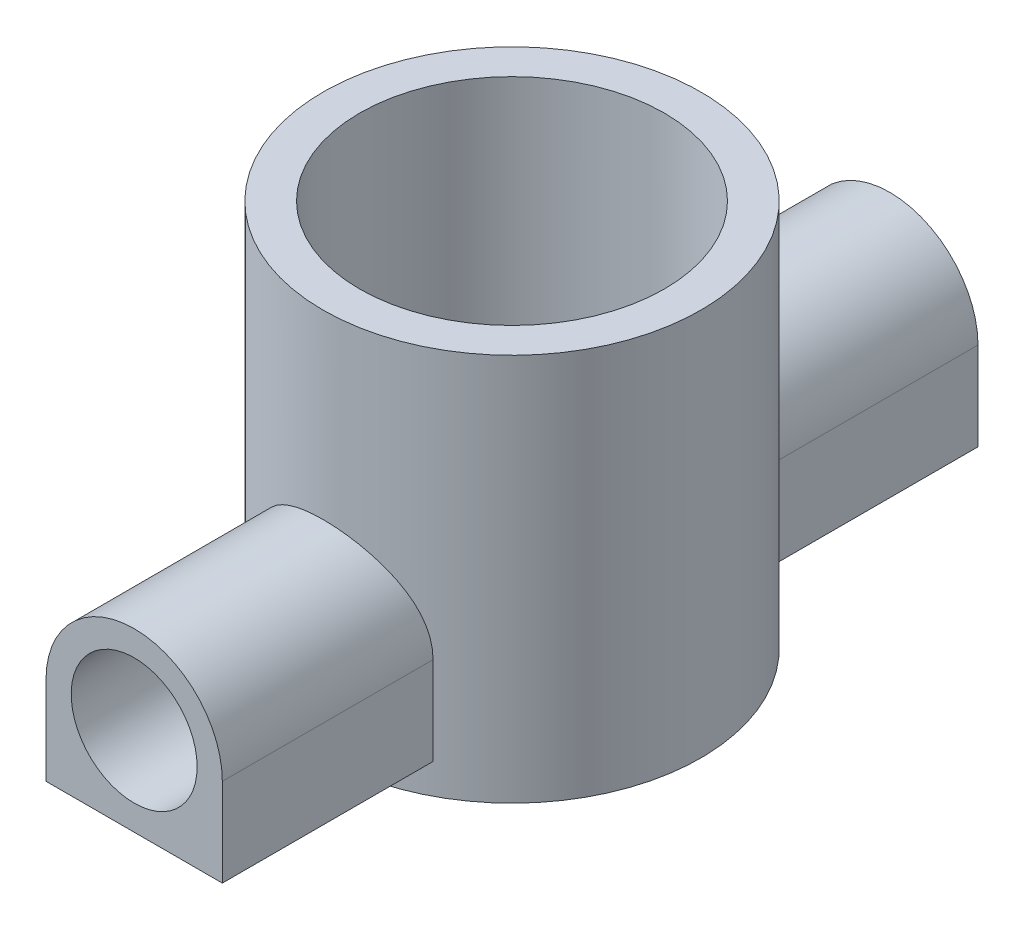
ISO-10303-21;
HEADER;
FILE_DESCRIPTION(('STEP AP214'),'2;1');
FILE_NAME('part.step','',(''),(''),'','','');
FILE_SCHEMA(('AUTOMOTIVE_DESIGN { 1 0 10303 214 1 1 1 1 }'));
ENDSEC;
DATA;
#1=APPLICATION_CONTEXT('core data for automotive mechanical design processes');
#2=APPLICATION_PROTOCOL_DEFINITION('international standard','automotive_design',2000,#1);
#3=PRODUCT_CONTEXT('',#1,'mechanical');
#4=PRODUCT('Part','Part','',(#3));
#5=PRODUCT_RELATED_PRODUCT_CATEGORY('part','',(#4));
#6=PRODUCT_DEFINITION_FORMATION('','',#4);
#7=PRODUCT_DEFINITION_CONTEXT('part definition',#1,'design');
#8=PRODUCT_DEFINITION('design','',#6,#7);
#9=PRODUCT_DEFINITION_SHAPE('','',#8);
#10=(LENGTH_UNIT() NAMED_UNIT(*) SI_UNIT(.MILLI.,.METRE.));
#11=(NAMED_UNIT(*) PLANE_ANGLE_UNIT() SI_UNIT($,.RADIAN.));
#12=(NAMED_UNIT(*) SI_UNIT($,.STERADIAN.) SOLID_ANGLE_UNIT());
#13=UNCERTAINTY_MEASURE_WITH_UNIT(LENGTH_MEASURE(1.E-05),#10,'distance_accuracy_value','');
#14=(GEOMETRIC_REPRESENTATION_CONTEXT(3) GLOBAL_UNCERTAINTY_ASSIGNED_CONTEXT((#13)) GLOBAL_UNIT_ASSIGNED_CONTEXT((#10,
#11,#12)) REPRESENTATION_CONTEXT('',''));
#15=CARTESIAN_POINT('',(0.,0.,0.));
#16=DIRECTION('',(0.,0.,1.));
#17=DIRECTION('',(1.,0.,0.));
#18=AXIS2_PLACEMENT_3D('',#15,#16,#17);
#19=CARTESIAN_POINT('',(0.,15.4,0.));
#20=DIRECTION('',(0.,-1.,0.));
#21=DIRECTION('',(0.,0.,-1.));
#22=AXIS2_PLACEMENT_3D('',#19,#20,#21);
#23=CYLINDRICAL_SURFACE('',#22,7.5);
#24=DIRECTION('',(0.,-1.,0.));
#25=VECTOR('',#24,1.);
#26=CARTESIAN_POINT('',(-3.5,15.4,-6.6332495807108));
#27=LINE('',#26,#25);
#28=CARTESIAN_POINT('',(-3.5,1.2,-6.6332495807108));
#29=VERTEX_POINT('',#28);
#30=CARTESIAN_POINT('',(-3.5,4.7,-6.6332495807108));
#31=VERTEX_POINT('',#30);
#32=EDGE_CURVE('E171',#29,#31,#27,.F.);
#33=ORIENTED_EDGE('',*,*,#32,.F.);
#34=CARTESIAN_POINT('',(0.,1.2,0.));
#35=DIRECTION('',(0.,1.,0.));
#36=DIRECTION('',(0.,0.,1.));
#37=AXIS2_PLACEMENT_3D('',#34,#35,#36);
#38=CIRCLE('',#37,7.5);
#39=CARTESIAN_POINT('',(3.5,1.2,-6.6332495807108));
#40=VERTEX_POINT('',#39);
#41=EDGE_CURVE('E164',#40,#29,#38,.T.);
#42=ORIENTED_EDGE('',*,*,#41,.F.);
#43=DIRECTION('',(0.,-1.,0.));
#44=VECTOR('',#43,1.);
#45=CARTESIAN_POINT('',(3.5,15.4,-6.6332495807108));
#46=LINE('',#45,#44);
#47=CARTESIAN_POINT('',(3.5,4.7,-6.6332495807108));
#48=VERTEX_POINT('',#47);
#49=EDGE_CURVE('E157',#40,#48,#46,.F.);
#50=ORIENTED_EDGE('',*,*,#49,.T.);
#51=CARTESIAN_POINT('',(0.,8.2,-7.5));
#52=CARTESIAN_POINT('',(0.0927638453646091,8.19999932260451,-7.49999942767583));
#53=CARTESIAN_POINT('',(0.185544973897901,8.19630725122517,-7.49827449171282));
#54=CARTESIAN_POINT('',(0.3704319500913,8.18157850785036,-7.4914182892734));
#55=CARTESIAN_POINT('',(0.462537422211857,8.1705380242676,-7.48628525503565));
#56=CARTESIAN_POINT('',(0.645509436311291,8.14120793246424,-7.47273316806579));
#57=CARTESIAN_POINT('',(0.736373591039177,8.1229059635181,-7.4643085126086));
#58=CARTESIAN_POINT('',(0.916063291209002,8.07925930665342,-7.4443954004826));
#59=CARTESIAN_POINT('',(1.00488798706432,8.05391173934351,-7.43290569126674));
#60=CARTESIAN_POINT('',(1.26666253016023,7.96789466452443,-7.39435378103281));
#61=CARTESIAN_POINT('',(1.43580119869903,7.89710574515754,-7.36313885007306));
#62=CARTESIAN_POINT('',(1.75950338829757,7.73105839599086,-7.29257773304033));
#63=CARTESIAN_POINT('',(1.9140693470767,7.63580406872244,-7.25323291046068));
#64=CARTESIAN_POINT('',(2.21388312396607,7.41752261873278,-7.1675879778359));
#65=CARTESIAN_POINT('',(2.35815845647141,7.29326112984414,-7.1210251056879));
#66=CARTESIAN_POINT('',(2.62467884488556,7.0231738101825,-7.02716673961223));
#67=CARTESIAN_POINT('',(2.74690939686651,6.87733389632691,-6.97987078542521));
#68=CARTESIAN_POINT('',(2.9738862328449,6.55660199043476,-6.88636735821798));
#69=CARTESIAN_POINT('',(3.07697229331171,6.38043558144155,-6.84043205060674));
#70=CARTESIAN_POINT('',(3.20791049641241,6.10348872920391,-6.77950058380062));
#71=CARTESIAN_POINT('',(3.24761799735631,6.00902100557189,-6.76051333791107));
#72=CARTESIAN_POINT('',(3.31874549019509,5.8164419545529,-6.72588242044448));
#73=CARTESIAN_POINT('',(3.35017010258259,5.71833269354297,-6.71023688566883));
#74=CARTESIAN_POINT('',(3.40284235726279,5.52472314293985,-6.68367312506865));
#75=CARTESIAN_POINT('',(3.42455692511124,5.42937889755627,-6.67254121789948));
#76=CARTESIAN_POINT('',(3.45996135373743,5.23687860867574,-6.65425164734672));
#77=CARTESIAN_POINT('',(3.47365522302899,5.13972349529254,-6.64709199883736));
#78=CARTESIAN_POINT('',(3.49283211593813,4.94442134510731,-6.63703590449111));
#79=CARTESIAN_POINT('',(3.4983187287039,4.84627476080538,-6.63413759512046));
#80=CARTESIAN_POINT('',(3.5010210042241,4.6498673249749,-6.63270993207384));
#81=CARTESIAN_POINT('',(3.49823728949815,4.55160648260323,-6.63418024956497));
#82=CARTESIAN_POINT('',(3.47889646600487,4.27773983042413,-6.64436341913261));
#83=CARTESIAN_POINT('',(3.45313558768331,4.102860565271,-6.65791178683922));
#84=CARTESIAN_POINT('',(3.37609411166591,3.76038253932222,-6.69729774655889));
#85=CARTESIAN_POINT('',(3.32480695547659,3.59278566163697,-6.72313849679124));
#86=CARTESIAN_POINT('',(3.19717816386537,3.26482846215623,-6.78477442823383));
#87=CARTESIAN_POINT('',(3.12028603410109,3.10472414431264,-6.82078542158217));
#88=CARTESIAN_POINT('',(2.94403037674033,2.79898260375468,-6.89869220896006));
#89=CARTESIAN_POINT('',(2.84465702922664,2.65335174325504,-6.94059057158502));
#90=CARTESIAN_POINT('',(2.61364416716534,2.36403389168892,-7.03106306694425));
#91=CARTESIAN_POINT('',(2.47967281957972,2.22227472917152,-7.07986810135457));
#92=CARTESIAN_POINT('',(2.18952336499836,1.96249689632761,-7.17490678271816));
#93=CARTESIAN_POINT('',(2.0333371656424,1.84448691528006,-7.22113948405388));
#94=CARTESIAN_POINT('',(1.69605016148321,1.63168691162194,-7.30785580019119));
#95=CARTESIAN_POINT('',(1.51426010828906,1.53787361396942,-7.34807600155865));
#96=CARTESIAN_POINT('',(1.13511968908022,1.38286818859894,-7.41609640475845));
#97=CARTESIAN_POINT('',(0.937780247501101,1.3216533888504,-7.44390523642785));
#98=CARTESIAN_POINT('',(0.549075448624818,1.23806153989473,-7.48222921873809));
#99=CARTESIAN_POINT('',(0.358377168623558,1.21310960658165,-7.4938877965312));
#100=CARTESIAN_POINT('',(-0.0248289899829373,1.19484164923643,-7.50240326670637));
#101=CARTESIAN_POINT('',(-0.217336137303141,1.20151334692313,-7.49926590380494));
#102=CARTESIAN_POINT('',(-0.585346655775639,1.24464943087465,-7.47924692484529));
#103=CARTESIAN_POINT('',(-0.761138118207001,1.27913469824773,-7.46327859026208));
#104=CARTESIAN_POINT('',(-1.10415343737415,1.37396324111249,-7.42029246708885));
#105=CARTESIAN_POINT('',(-1.2713762886416,1.43430954347702,-7.39327338509468));
#106=CARTESIAN_POINT('',(-1.59836577643509,1.58097349973798,-7.32965455475482));
#107=CARTESIAN_POINT('',(-1.7577468744526,1.66803037496716,-7.29278658042767));
#108=CARTESIAN_POINT('',(-2.06020334105628,1.86483606762935,-7.21318654056169));
#109=CARTESIAN_POINT('',(-2.20327150158043,1.97459485635478,-7.17045190100833));
#110=CARTESIAN_POINT('',(-2.4823180096738,2.22487644520006,-7.0789482010265));
#111=CARTESIAN_POINT('',(-2.61657054991578,2.36725436671502,-7.02997877267032));
#112=CARTESIAN_POINT('',(-2.85993721540419,2.67294486789053,-6.93454280124186));
#113=CARTESIAN_POINT('',(-2.96903933820144,2.83626738524768,-6.88807746125837));
#114=CARTESIAN_POINT('',(-3.16218147379911,3.18613434681733,-6.80163199385778));
#115=CARTESIAN_POINT('',(-3.24529405280429,3.37326008207658,-6.76191102793616));
#116=CARTESIAN_POINT('',(-3.37798692200635,3.76131515608505,-6.69662339878012));
#117=CARTESIAN_POINT('',(-3.427604313045,3.96222894977932,-6.67104108063186));
#118=CARTESIAN_POINT('',(-3.48780904215959,4.3526888681153,-6.63974657685124));
#119=CARTESIAN_POINT('',(-3.50151146735279,4.54162714764103,-6.63245112375186));
#120=CARTESIAN_POINT('',(-3.49822481559427,4.91913456236046,-6.63418718298948));
#121=CARTESIAN_POINT('',(-3.48124435914999,5.10770378634161,-6.64321410947364));
#122=CARTESIAN_POINT('',(-3.41988100883993,5.46475014177479,-6.674987185247));
#123=CARTESIAN_POINT('',(-3.37758601959937,5.63368984620401,-6.69668521740729));
#124=CARTESIAN_POINT('',(-3.26913984460832,5.96199576355792,-6.75028601323557));
#125=CARTESIAN_POINT('',(-3.20298155265185,6.12135910824862,-6.7821918163354));
#126=CARTESIAN_POINT('',(-3.04371067133753,6.43759115600262,-6.85521498886291));
#127=CARTESIAN_POINT('',(-2.94910293756554,6.59359539934138,-6.89680253184365));
#128=CARTESIAN_POINT('',(-2.73743366831169,6.88847533118703,-6.9835181206314));
#129=CARTESIAN_POINT('',(-2.62036164941979,7.02734297264253,-7.02864781362001));
#130=CARTESIAN_POINT('',(-2.35327737967147,7.29843077725675,-7.12278662309544));
#131=CARTESIAN_POINT('',(-2.20113848145156,7.42858536167878,-7.17173056467306));
#132=CARTESIAN_POINT('',(-1.87546575175447,7.66187137331207,-7.26368760962734));
#133=CARTESIAN_POINT('',(-1.70192179975452,7.76498994505046,-7.30669788699116));
#134=CARTESIAN_POINT('',(-1.42948200173221,7.89636114009806,-7.36309694154533));
#135=CARTESIAN_POINT('',(-1.33685004556919,7.93620917842171,-7.38051647750378));
#136=CARTESIAN_POINT('',(-1.14803708873528,8.00789778489746,-7.41222958111216));
#137=CARTESIAN_POINT('',(-1.05185784004172,8.039742246791,-7.42652466836398));
#138=CARTESIAN_POINT('',(-0.856902795337602,8.09499107130347,-7.45153410473169));
#139=CARTESIAN_POINT('',(-0.758133588460742,8.11841497284418,-7.46225673901333));
#140=CARTESIAN_POINT('',(-0.55864641216854,8.15661887752538,-7.47983449505061));
#141=CARTESIAN_POINT('',(-0.457929779112262,8.1714046050576,-7.48669217794642));
#142=CARTESIAN_POINT('',(-0.297487480193374,8.187842785519,-7.49433264911904));
#143=CARTESIAN_POINT('',(-0.238106005252081,8.19239926706965,-7.49645553942725));
#144=CARTESIAN_POINT('',(-0.119152065908935,8.19847812211285,-7.49928941274602));
#145=CARTESIAN_POINT('',(-0.0595795977204067,8.20000043507199,-7.50000036758765));
#146=CARTESIAN_POINT('',(0.,8.2,-7.5));
#147=B_SPLINE_CURVE_WITH_KNOTS('',3,(#51,#52,#53,#54,#55,#56,#57,#58,#59,#60,#61,#62,#63,#64,
#65,#66,#67,#68,#69,#70,#71,#72,#73,#74,#75,#76,#77,#78,#79,#80,#81,#82,#83,#84,#85,#86,#87,#88,
#89,#90,#91,#92,#93,#94,#95,#96,#97,#98,#99,#100,#101,#102,#103,#104,#105,#106,#107,#108,#109,
#110,#111,#112,#113,#114,#115,#116,#117,#118,#119,#120,#121,#122,#123,#124,#125,#126,#127,#128,
#129,#130,#131,#132,#133,#134,#135,#136,#137,#138,#139,#140,#141,#142,#143,#144,#145,#146),
.UNSPECIFIED.,.T.,.F.,(4,2,2,2,2,2,2,2,2,2,2,2,2,2,2,2,2,2,2,2,2,2,2,2,2,2,2,2,2,2,2,2,2,2,2,2,
2,2,2,2,2,2,2,2,2,2,2,4),(0.,0.278231948691083,0.556608327586484,0.835460614510282,
1.11442703061858,1.66968567671646,2.22485127386643,2.81039094929482,3.39631447468597,
4.02045147283506,4.33274243906661,4.64485882771903,4.93970407469387,5.23440184050609,
5.52897069314465,5.82351737371777,6.35264790107148,6.88191444872486,7.42338613242744,
7.96509479212314,8.56561945447959,9.16636343712319,9.788504036431,10.4102113742534,
10.985156722838,11.5598788597914,12.0969740408906,12.6341321028075,13.1877514083731,
13.7416143968142,14.3441139862917,14.9469005121136,15.5692340232258,16.1908770725114,
16.7564837638741,17.321931569945,17.8461577421246,18.3705401516402,18.9296569883146,
19.4890353854765,20.1045488653448,20.7203544898078,21.0270042419757,21.3335045189413,
21.6392889361398,21.9448704839423,22.1235674407271,22.3022679625826),.UNSPECIFIED.);
#148=EDGE_CURVE('E166',#31,#48,#147,.T.);
#149=ORIENTED_EDGE('',*,*,#148,.F.);
#150=EDGE_LOOP('',(#33,#42,#50,#149));
#151=FACE_BOUND('',#150,.T.);
#152=CARTESIAN_POINT('',(0.,15.4,0.));
#153=DIRECTION('',(0.,1.,0.));
#154=DIRECTION('',(0.,0.,1.));
#155=AXIS2_PLACEMENT_3D('',#152,#153,#154);
#156=CIRCLE('',#155,7.5);
#157=CARTESIAN_POINT('',(0.,15.4,7.5));
#158=VERTEX_POINT('',#157);
#159=EDGE_CURVE('E154',#158,#158,#156,.T.);
#160=ORIENTED_EDGE('',*,*,#159,.F.);
#161=EDGE_LOOP('',(#160));
#162=FACE_BOUND('',#161,.T.);
#163=CARTESIAN_POINT('',(0.,0.,0.));
#164=DIRECTION('',(0.,1.,0.));
#165=DIRECTION('',(0.,0.,1.));
#166=AXIS2_PLACEMENT_3D('',#163,#164,#165);
#167=CIRCLE('',#166,7.5);
#168=CARTESIAN_POINT('',(0.,0.,7.5));
#169=VERTEX_POINT('',#168);
#170=EDGE_CURVE('E158',#169,#169,#167,.T.);
#171=ORIENTED_EDGE('',*,*,#170,.T.);
#172=EDGE_LOOP('',(#171));
#173=FACE_BOUND('',#172,.T.);
#174=DIRECTION('',(0.,-1.,0.));
#175=VECTOR('',#174,1.);
#176=CARTESIAN_POINT('',(-3.5,15.4,6.6332495807108));
#177=LINE('',#176,#175);
#178=CARTESIAN_POINT('',(-3.5,4.7,6.6332495807108));
#179=VERTEX_POINT('',#178);
#180=CARTESIAN_POINT('',(-3.5,1.2,6.6332495807108));
#181=VERTEX_POINT('',#180);
#182=EDGE_CURVE('E12',#179,#181,#177,.T.);
#183=ORIENTED_EDGE('',*,*,#182,.F.);
#184=CARTESIAN_POINT('',(-3.5,4.7,6.6332495807108));
#185=CARTESIAN_POINT('',(-3.49999926131128,4.60785613938988,6.63325043965867));
#186=CARTESIAN_POINT('',(-3.49635593724679,4.51569336032134,6.63517633755873));
#187=CARTESIAN_POINT('',(-3.48182616818394,4.33206166603421,6.64281200802185));
#188=CARTESIAN_POINT('',(-3.47093577020917,4.24059315706568,6.6485238456503));
#189=CARTESIAN_POINT('',(-3.44201715681388,4.05891520694296,6.66354142730972));
#190=CARTESIAN_POINT('',(-3.42397598741124,3.96870836009927,6.67285369294168));
#191=CARTESIAN_POINT('',(-3.38097200645888,3.79035202706629,6.6947445505249));
#192=CARTESIAN_POINT('',(-3.35600623171901,3.70220343919812,6.70732454066034));
#193=CARTESIAN_POINT('',(-3.271387476881,3.44263634342261,6.74922269793659));
#194=CARTESIAN_POINT('',(-3.20183735269974,3.27501535949099,6.78279629307568));
#195=CARTESIAN_POINT('',(-3.03871915346707,2.95395097886513,6.85741831296518));
#196=CARTESIAN_POINT('',(-2.94515259204987,2.80050668951429,6.89846626659733));
#197=CARTESIAN_POINT('',(-2.72878224921516,2.49990522846133,6.98701266587335));
#198=CARTESIAN_POINT('',(-2.60436854334458,2.35397811886385,7.03476239297403));
#199=CARTESIAN_POINT('',(-2.33320405382943,2.0841294125564,7.12928988190124));
#200=CARTESIAN_POINT('',(-2.18644333500182,1.96021765693643,7.17606720084288));
#201=CARTESIAN_POINT('',(-1.86452679822815,1.73103846377823,7.26656834223257));
#202=CARTESIAN_POINT('',(-1.6882307420245,1.6272322571775,7.30996718088236));
#203=CARTESIAN_POINT('',(-1.31827760423816,1.4513037009945,7.3856412674133));
#204=CARTESIAN_POINT('',(-1.12463017132352,1.37916387257901,7.41792264965132));
#205=CARTESIAN_POINT('',(-0.738475207353315,1.27331732443001,7.46592765984064));
#206=CARTESIAN_POINT('',(-0.546672377252428,1.23746567659284,7.48257054310927));
#207=CARTESIAN_POINT('',(-0.159103476100376,1.19820517449856,7.5008162742564));
#208=CARTESIAN_POINT('',(0.036660489268547,1.19477951469839,7.50242691294878));
#209=CARTESIAN_POINT('',(0.410695330611613,1.21951469763489,7.4909075993106));
#210=CARTESIAN_POINT('',(0.58916503565865,1.24529497306625,7.47888852606437));
#211=CARTESIAN_POINT('',(0.938902152687619,1.32352572395687,7.4430755092787));
#212=CARTESIAN_POINT('',(1.11016902876457,1.37597818009267,7.4192806912758));
#213=CARTESIAN_POINT('',(1.44378221998318,1.50655754490628,7.36169830806362));
#214=CARTESIAN_POINT('',(1.60595739011388,1.58505571152273,7.32776699747503));
#215=CARTESIAN_POINT('',(1.91525132180226,1.76506088200437,7.25307965956888));
#216=CARTESIAN_POINT('',(2.06236453370182,1.8665763227356,7.21232113120368));
#217=CARTESIAN_POINT('',(2.35069007475366,2.09971632071152,7.12382550391317));
#218=CARTESIAN_POINT('',(2.49033646243841,2.23316731605842,7.07578970458541));
#219=CARTESIAN_POINT('',(2.74603848228227,2.52136419179472,6.98053903056489));
#220=CARTESIAN_POINT('',(2.86207997004237,2.67612274740592,6.93332466348922));
#221=CARTESIAN_POINT('',(3.07289421264302,3.01225185768652,6.84260060059413));
#222=CARTESIAN_POINT('',(3.16632273686182,3.19456294651887,6.79939178934865));
#223=CARTESIAN_POINT('',(3.28192113830258,3.47953018448027,6.74394606599791));
#224=CARTESIAN_POINT('',(3.31636861599758,3.57646108769959,6.72702242161305));
#225=CARTESIAN_POINT('',(3.37671201980083,3.77349705237814,6.69693644311859));
#226=CARTESIAN_POINT('',(3.40261288757297,3.87360024278493,6.68377193606454));
#227=CARTESIAN_POINT('',(3.44391578144786,4.06862628480971,6.66257769524817));
#228=CARTESIAN_POINT('',(3.45995493643312,4.16338134341116,6.65423909825648));
#229=CARTESIAN_POINT('',(3.48419262800498,4.35411392168352,6.64158034275249));
#230=CARTESIAN_POINT('',(3.49239499947884,4.45009082012979,6.63725821882937));
#231=CARTESIAN_POINT('',(3.50085062954339,4.64247532564968,6.63280265407604));
#232=CARTESIAN_POINT('',(3.50110572563237,4.73888282800709,6.63266824499968));
#233=CARTESIAN_POINT('',(3.49367901057855,4.93127729604442,6.63658141347895));
#234=CARTESIAN_POINT('',(3.48599758814267,5.02726428208875,6.64062878622342));
#235=CARTESIAN_POINT('',(3.45324638584259,5.29633533441687,6.65775748040969));
#236=CARTESIAN_POINT('',(3.4190840761011,5.46811302057922,6.67552471879317));
#237=CARTESIAN_POINT('',(3.32616520624864,5.80314649255415,6.72229645159043));
#238=CARTESIAN_POINT('',(3.26740179307056,5.96639988951355,6.75130407704271));
#239=CARTESIAN_POINT('',(3.12403403965031,6.28835223510954,6.8188675797935));
#240=CARTESIAN_POINT('',(3.03836581226062,6.44649666789497,6.85780114432773));
#241=CARTESIAN_POINT('',(2.84459425000124,6.7470216127766,6.94041543951003));
#242=CARTESIAN_POINT('',(2.73647983367251,6.8893942850686,6.98409850984871));
#243=CARTESIAN_POINT('',(2.48734285087687,7.17022319151001,7.07690614557722));
#244=CARTESIAN_POINT('',(2.34403888577291,7.30663725802437,7.12611360813319));
#245=CARTESIAN_POINT('',(2.03561304104541,7.55400821664125,7.22026743382273));
#246=CARTESIAN_POINT('',(1.87048659408059,7.66495976622107,7.26521290154959));
#247=CARTESIAN_POINT('',(1.51947024529831,7.85943409867268,7.34670682708664));
#248=CARTESIAN_POINT('',(1.33331127569034,7.94253061493065,7.38312242529594));
#249=CARTESIAN_POINT('',(0.947480328770498,8.07547435431301,7.44246322384021));
#250=CARTESIAN_POINT('',(0.747818780316316,8.12534692241486,7.46539870594139));
#251=CARTESIAN_POINT('',(0.358651339101251,8.1866726516826,7.49374585119208));
#252=CARTESIAN_POINT('',(0.169689224472713,8.20098570068088,7.5004606553489));
#253=CARTESIAN_POINT('',(-0.208004011053015,8.19890944076257,7.49949041112254));
#254=CARTESIAN_POINT('',(-0.396735180040015,8.18252830135038,7.49180919435564));
#255=CARTESIAN_POINT('',(-0.758277575824747,8.12153128417566,7.46365916594198));
#256=CARTESIAN_POINT('',(-0.931404852084313,8.07843945832568,7.44388132123884));
#257=CARTESIAN_POINT('',(-1.26778311811106,7.96712840884814,7.39402864886138));
#258=CARTESIAN_POINT('',(-1.43103249754564,7.89890510097077,7.36395214755402));
#259=CARTESIAN_POINT('',(-1.75125880642597,7.73592342663712,7.29459745102416));
#260=CARTESIAN_POINT('',(-1.9076154395029,7.64010190987166,7.25496378476882));
#261=CARTESIAN_POINT('',(-2.20271728406843,7.42604006882807,7.17088679464799));
#262=CARTESIAN_POINT('',(-2.34145452865148,7.30778966277994,7.1264413117453));
#263=CARTESIAN_POINT('',(-2.6100692474085,7.04020660725797,7.03274489555197));
#264=CARTESIAN_POINT('',(-2.73811546970186,6.88906156070508,6.98341321740506));
#265=CARTESIAN_POINT('',(-2.96757613147988,6.56619222573724,6.88904451074315));
#266=CARTESIAN_POINT('',(-3.06897170586697,6.39445348429391,6.84401053871511));
#267=CARTESIAN_POINT('',(-3.19913423254043,6.12331143846475,6.78364714955043));
#268=CARTESIAN_POINT('',(-3.23907342645553,6.02995069293831,6.76461324461053));
#269=CARTESIAN_POINT('',(-3.31083809378394,5.83959564069816,6.72978037193507));
#270=CARTESIAN_POINT('',(-3.34266769160988,5.74260320990733,6.71397976060548));
#271=CARTESIAN_POINT('',(-3.39775826940733,5.54595653504874,6.68626866476573));
#272=CARTESIAN_POINT('',(-3.42104161787016,5.44630998252332,6.67434803441087));
#273=CARTESIAN_POINT('',(-3.45882212262022,5.24499746726423,6.6548482997478));
#274=CARTESIAN_POINT('',(-3.4733257000903,5.14333303666771,6.64726602275977));
#275=CARTESIAN_POINT('',(-3.4888820741993,4.98450720602331,6.63910656509959));
#276=CARTESIAN_POINT('',(-3.49304884992003,4.92771337273911,6.63691338325277));
#277=CARTESIAN_POINT('',(-3.49860810504594,4.81394877625615,6.63398459194967));
#278=CARTESIAN_POINT('',(-3.50000045677498,4.75697800503572,6.63324904957247));
#279=CARTESIAN_POINT('',(-3.5,4.7,6.6332495807108));
#280=B_SPLINE_CURVE_WITH_KNOTS('',3,(#184,#185,#186,#187,#188,#189,#190,#191,#192,#193,#194,
#195,#196,#197,#198,#199,#200,#201,#202,#203,#204,#205,#206,#207,#208,#209,#210,#211,#212,#213,
#214,#215,#216,#217,#218,#219,#220,#221,#222,#223,#224,#225,#226,#227,#228,#229,#230,#231,#232,
#233,#234,#235,#236,#237,#238,#239,#240,#241,#242,#243,#244,#245,#246,#247,#248,#249,#250,#251,
#252,#253,#254,#255,#256,#257,#258,#259,#260,#261,#262,#263,#264,#265,#266,#267,#268,#269,#270,
#271,#272,#273,#274,#275,#276,#277,#278,#279),.UNSPECIFIED.,.T.,.F.,(4,2,2,2,2,2,2,2,2,2,2,2,2,
2,2,2,2,2,2,2,2,2,2,2,2,2,2,2,2,2,2,2,2,2,2,2,2,2,2,2,2,2,2,2,2,2,2,4),(0.,0.276372470319851,
0.552895813990725,0.82992240006127,1.10706771525189,1.6581011458798,2.20909985618996,
2.79941855321357,3.39000046847941,4.01417190802138,4.63799839023429,5.22231177145619,
5.80632230171524,6.34595217268062,6.8856221224215,7.4333410683062,7.98126110330555,
8.57578045456666,9.17065500781635,9.79510464889735,10.1074819520462,10.4196783203378,
10.7086761309505,10.99753244952,11.2863219808071,11.575097368718,12.1006122475418,
12.6262736152265,13.1761037763696,13.7262060314043,14.3350584888907,14.9440385786994,
15.5619525819757,16.1793946664684,16.7452887216272,17.3110321809392,17.8471387495322,
18.3833324820987,18.9438451037422,19.5046102750793,20.1143376551856,20.7244954854502,
21.0340784061528,21.3435035621507,21.65211297095,21.9604964012874,22.1313860002654,
22.3022834632255),.UNSPECIFIED.);
#281=CARTESIAN_POINT('',(3.5,4.7,6.6332495807108));
#282=VERTEX_POINT('',#281);
#283=EDGE_CURVE('E50',#282,#179,#280,.T.);
#284=ORIENTED_EDGE('',*,*,#283,.F.);
#285=DIRECTION('',(0.,-1.,0.));
#286=VECTOR('',#285,1.);
#287=CARTESIAN_POINT('',(3.5,15.4,6.6332495807108));
#288=LINE('',#287,#286);
#289=CARTESIAN_POINT('',(3.5,1.2,6.6332495807108));
#290=VERTEX_POINT('',#289);
#291=EDGE_CURVE('E188',#282,#290,#288,.T.);
#292=ORIENTED_EDGE('',*,*,#291,.T.);
#293=EDGE_CURVE('E119',#181,#290,#38,.T.);
#294=ORIENTED_EDGE('',*,*,#293,.F.);
#295=EDGE_LOOP('',(#183,#284,#292,#294));
#296=FACE_BOUND('',#295,.T.);
#297=ADVANCED_FACE('F37',(#151,#162,#173,#296),#23,.T.);
#298=CARTESIAN_POINT('',(0.,15.4,0.));
#299=DIRECTION('',(0.,1.,0.));
#300=DIRECTION('',(0.,0.,1.));
#301=AXIS2_PLACEMENT_3D('',#298,#299,#300);
#302=PLANE('',#301);
#303=CARTESIAN_POINT('',(0.,15.4,0.));
#304=DIRECTION('',(0.,1.,0.));
#305=DIRECTION('',(0.,0.,1.));
#306=AXIS2_PLACEMENT_3D('',#303,#304,#305);
#307=CIRCLE('',#306,6.05);
#308=CARTESIAN_POINT('',(0.,15.4,6.05));
#309=VERTEX_POINT('',#308);
#310=EDGE_CURVE('E309',#309,#309,#307,.T.);
#311=ORIENTED_EDGE('',*,*,#310,.F.);
#312=EDGE_LOOP('',(#311));
#313=FACE_BOUND('',#312,.T.);
#314=ORIENTED_EDGE('',*,*,#159,.T.);
#315=EDGE_LOOP('',(#314));
#316=FACE_BOUND('',#315,.T.);
#317=ADVANCED_FACE('F218',(#313,#316),#302,.T.);
#318=CARTESIAN_POINT('',(0.,0.,0.));
#319=DIRECTION('',(0.,1.,0.));
#320=DIRECTION('',(0.,0.,1.));
#321=AXIS2_PLACEMENT_3D('',#318,#319,#320);
#322=PLANE('',#321);
#323=CARTESIAN_POINT('',(0.,0.,0.));
#324=DIRECTION('',(0.,-1.,0.));
#325=DIRECTION('',(0.,0.,-1.));
#326=AXIS2_PLACEMENT_3D('',#323,#324,#325);
#327=CIRCLE('',#326,1.75);
#328=CARTESIAN_POINT('',(0.,0.,-1.75));
#329=VERTEX_POINT('',#328);
#330=EDGE_CURVE('E306',#329,#329,#327,.T.);
#331=ORIENTED_EDGE('',*,*,#330,.F.);
#332=EDGE_LOOP('',(#331));
#333=FACE_BOUND('',#332,.T.);
#334=ORIENTED_EDGE('',*,*,#170,.F.);
#335=EDGE_LOOP('',(#334));
#336=FACE_BOUND('',#335,.T.);
#337=ADVANCED_FACE('F223',(#333,#336),#322,.F.);
#338=CARTESIAN_POINT('',(0.,0.,-15.));
#339=DIRECTION('',(0.,0.,1.));
#340=DIRECTION('',(1.,0.,0.));
#341=AXIS2_PLACEMENT_3D('',#338,#339,#340);
#342=PLANE('',#341);
#343=CARTESIAN_POINT('',(0.,4.7,-15.));
#344=DIRECTION('',(0.,0.,-1.));
#345=DIRECTION('',(-1.,0.,0.));
#346=AXIS2_PLACEMENT_3D('',#343,#344,#345);
#347=CIRCLE('',#346,2.5);
#348=CARTESIAN_POINT('',(-2.5,4.7,-15.));
#349=VERTEX_POINT('',#348);
#350=EDGE_CURVE('E193',#349,#349,#347,.T.);
#351=ORIENTED_EDGE('',*,*,#350,.F.);
#352=EDGE_LOOP('',(#351));
#353=FACE_BOUND('',#352,.T.);
#354=CARTESIAN_POINT('',(0.,4.7,-15.));
#355=DIRECTION('',(0.,0.,1.));
#356=DIRECTION('',(1.,0.,0.));
#357=AXIS2_PLACEMENT_3D('',#354,#355,#356);
#358=CIRCLE('',#357,3.5);
#359=CARTESIAN_POINT('',(3.5,4.7,-15.));
#360=VERTEX_POINT('',#359);
#361=CARTESIAN_POINT('',(-3.5,4.7,-15.));
#362=VERTEX_POINT('',#361);
#363=EDGE_CURVE('E161',#360,#362,#358,.T.);
#364=ORIENTED_EDGE('',*,*,#363,.F.);
#365=DIRECTION('',(0.,-1.,0.));
#366=VECTOR('',#365,1.);
#367=CARTESIAN_POINT('',(3.5,4.7,-15.));
#368=LINE('',#367,#366);
#369=CARTESIAN_POINT('',(3.5,1.2,-15.));
#370=VERTEX_POINT('',#369);
#371=EDGE_CURVE('E121',#360,#370,#368,.T.);
#372=ORIENTED_EDGE('',*,*,#371,.T.);
#373=DIRECTION('',(1.,0.,0.));
#374=VECTOR('',#373,1.);
#375=CARTESIAN_POINT('',(-3.5,1.2,-15.));
#376=LINE('',#375,#374);
#377=CARTESIAN_POINT('',(-3.5,1.2,-15.));
#378=VERTEX_POINT('',#377);
#379=EDGE_CURVE('E239',#378,#370,#376,.T.);
#380=ORIENTED_EDGE('',*,*,#379,.F.);
#381=DIRECTION('',(0.,-1.,0.));
#382=VECTOR('',#381,1.);
#383=CARTESIAN_POINT('',(-3.5,4.7,-15.));
#384=LINE('',#383,#382);
#385=EDGE_CURVE('E128',#362,#378,#384,.T.);
#386=ORIENTED_EDGE('',*,*,#385,.F.);
#387=EDGE_LOOP('',(#364,#372,#380,#386));
#388=FACE_BOUND('',#387,.T.);
#389=ADVANCED_FACE('F182',(#353,#388),#342,.F.);
#390=CARTESIAN_POINT('',(-3.5,4.7,7.5));
#391=DIRECTION('',(1.,0.,0.));
#392=DIRECTION('',(0.,0.,-1.));
#393=AXIS2_PLACEMENT_3D('',#390,#391,#392);
#394=PLANE('',#393);
#395=DIRECTION('',(0.,0.,-1.));
#396=VECTOR('',#395,1.);
#397=CARTESIAN_POINT('',(-3.5,1.2,7.5));
#398=LINE('',#397,#396);
#399=EDGE_CURVE('E144',#29,#378,#398,.T.);
#400=ORIENTED_EDGE('',*,*,#399,.F.);
#401=ORIENTED_EDGE('',*,*,#32,.T.);
#402=DIRECTION('',(0.,0.,-1.));
#403=VECTOR('',#402,1.);
#404=CARTESIAN_POINT('',(-3.5,4.7,7.5));
#405=LINE('',#404,#403);
#406=EDGE_CURVE('E131',#31,#362,#405,.T.);
#407=ORIENTED_EDGE('',*,*,#406,.T.);
#408=ORIENTED_EDGE('',*,*,#385,.T.);
#409=EDGE_LOOP('',(#400,#401,#407,#408));
#410=FACE_BOUND('',#409,.T.);
#411=ADVANCED_FACE('F276',(#410),#394,.F.);
#412=CARTESIAN_POINT('',(3.5,4.7,7.5));
#413=DIRECTION('',(1.,0.,0.));
#414=DIRECTION('',(0.,0.,-1.));
#415=AXIS2_PLACEMENT_3D('',#412,#413,#414);
#416=PLANE('',#415);
#417=ORIENTED_EDGE('',*,*,#49,.F.);
#418=DIRECTION('',(0.,0.,-1.));
#419=VECTOR('',#418,1.);
#420=CARTESIAN_POINT('',(3.5,1.2,7.5));
#421=LINE('',#420,#419);
#422=EDGE_CURVE('E122',#40,#370,#421,.T.);
#423=ORIENTED_EDGE('',*,*,#422,.T.);
#424=ORIENTED_EDGE('',*,*,#371,.F.);
#425=DIRECTION('',(0.,0.,-1.));
#426=VECTOR('',#425,1.);
#427=CARTESIAN_POINT('',(3.5,4.7,7.5));
#428=LINE('',#427,#426);
#429=EDGE_CURVE('E66',#48,#360,#428,.T.);
#430=ORIENTED_EDGE('',*,*,#429,.F.);
#431=EDGE_LOOP('',(#417,#423,#424,#430));
#432=FACE_BOUND('',#431,.T.);
#433=ADVANCED_FACE('F271',(#432),#416,.T.);
#434=CARTESIAN_POINT('',(-3.5,1.2,7.5));
#435=DIRECTION('',(0.,1.,0.));
#436=DIRECTION('',(0.,0.,1.));
#437=AXIS2_PLACEMENT_3D('',#434,#435,#436);
#438=PLANE('',#437);
#439=ORIENTED_EDGE('',*,*,#422,.F.);
#440=ORIENTED_EDGE('',*,*,#41,.T.);
#441=ORIENTED_EDGE('',*,*,#399,.T.);
#442=ORIENTED_EDGE('',*,*,#379,.T.);
#443=EDGE_LOOP('',(#439,#440,#441,#442));
#444=FACE_BOUND('',#443,.T.);
#445=ADVANCED_FACE('F179',(#444),#438,.F.);
#446=CARTESIAN_POINT('',(0.,4.7,7.5));
#447=DIRECTION('',(0.,0.,-1.));
#448=DIRECTION('',(-1.,0.,0.));
#449=AXIS2_PLACEMENT_3D('',#446,#447,#448);
#450=CYLINDRICAL_SURFACE('',#449,3.5);
#451=ORIENTED_EDGE('',*,*,#406,.F.);
#452=ORIENTED_EDGE('',*,*,#148,.T.);
#453=ORIENTED_EDGE('',*,*,#429,.T.);
#454=ORIENTED_EDGE('',*,*,#363,.T.);
#455=EDGE_LOOP('',(#451,#452,#453,#454));
#456=FACE_BOUND('',#455,.T.);
#457=ADVANCED_FACE('F173',(#456),#450,.T.);
#458=CARTESIAN_POINT('',(3.5,4.7,15.));
#459=VERTEX_POINT('',#458);
#460=EDGE_CURVE('E126',#459,#282,#428,.T.);
#461=ORIENTED_EDGE('',*,*,#460,.T.);
#462=ORIENTED_EDGE('',*,*,#283,.T.);
#463=CARTESIAN_POINT('',(-3.5,4.7,15.));
#464=VERTEX_POINT('',#463);
#465=EDGE_CURVE('E141',#464,#179,#405,.T.);
#466=ORIENTED_EDGE('',*,*,#465,.F.);
#467=CARTESIAN_POINT('',(0.,4.7,15.));
#468=DIRECTION('',(0.,0.,1.));
#469=DIRECTION('',(1.,0.,0.));
#470=AXIS2_PLACEMENT_3D('',#467,#468,#469);
#471=CIRCLE('',#470,3.5);
#472=EDGE_CURVE('E249',#459,#464,#471,.T.);
#473=ORIENTED_EDGE('',*,*,#472,.F.);
#474=EDGE_LOOP('',(#461,#462,#466,#473));
#475=FACE_BOUND('',#474,.T.);
#476=ADVANCED_FACE('F178',(#475),#450,.T.);
#477=ORIENTED_EDGE('',*,*,#465,.T.);
#478=ORIENTED_EDGE('',*,*,#182,.T.);
#479=CARTESIAN_POINT('',(-3.5,1.2,15.));
#480=VERTEX_POINT('',#479);
#481=EDGE_CURVE('E237',#480,#181,#398,.T.);
#482=ORIENTED_EDGE('',*,*,#481,.F.);
#483=DIRECTION('',(0.,-1.,0.));
#484=VECTOR('',#483,1.);
#485=CARTESIAN_POINT('',(-3.5,4.7,15.));
#486=LINE('',#485,#484);
#487=EDGE_CURVE('E113',#464,#480,#486,.T.);
#488=ORIENTED_EDGE('',*,*,#487,.F.);
#489=EDGE_LOOP('',(#477,#478,#482,#488));
#490=FACE_BOUND('',#489,.T.);
#491=ADVANCED_FACE('F236',(#490),#394,.F.);
#492=ORIENTED_EDGE('',*,*,#291,.F.);
#493=ORIENTED_EDGE('',*,*,#460,.F.);
#494=DIRECTION('',(0.,-1.,0.));
#495=VECTOR('',#494,1.);
#496=CARTESIAN_POINT('',(3.5,4.7,15.));
#497=LINE('',#496,#495);
#498=CARTESIAN_POINT('',(3.5,1.2,15.));
#499=VERTEX_POINT('',#498);
#500=EDGE_CURVE('E111',#459,#499,#497,.T.);
#501=ORIENTED_EDGE('',*,*,#500,.T.);
#502=EDGE_CURVE('E58',#499,#290,#421,.T.);
#503=ORIENTED_EDGE('',*,*,#502,.T.);
#504=EDGE_LOOP('',(#492,#493,#501,#503));
#505=FACE_BOUND('',#504,.T.);
#506=ADVANCED_FACE('F124',(#505),#416,.T.);
#507=CARTESIAN_POINT('',(0.,0.,15.));
#508=DIRECTION('',(0.,0.,1.));
#509=DIRECTION('',(1.,0.,0.));
#510=AXIS2_PLACEMENT_3D('',#507,#508,#509);
#511=PLANE('',#510);
#512=CARTESIAN_POINT('',(0.,4.7,15.));
#513=DIRECTION('',(0.,0.,1.));
#514=DIRECTION('',(1.,0.,0.));
#515=AXIS2_PLACEMENT_3D('',#512,#513,#514);
#516=CIRCLE('',#515,2.5);
#517=CARTESIAN_POINT('',(2.5,4.7,15.));
#518=VERTEX_POINT('',#517);
#519=EDGE_CURVE('E302',#518,#518,#516,.T.);
#520=ORIENTED_EDGE('',*,*,#519,.F.);
#521=EDGE_LOOP('',(#520));
#522=FACE_BOUND('',#521,.T.);
#523=ORIENTED_EDGE('',*,*,#472,.T.);
#524=ORIENTED_EDGE('',*,*,#487,.T.);
#525=DIRECTION('',(1.,0.,0.));
#526=VECTOR('',#525,1.);
#527=CARTESIAN_POINT('',(-3.5,1.2,15.));
#528=LINE('',#527,#526);
#529=EDGE_CURVE('E108',#480,#499,#528,.T.);
#530=ORIENTED_EDGE('',*,*,#529,.T.);
#531=ORIENTED_EDGE('',*,*,#500,.F.);
#532=EDGE_LOOP('',(#523,#524,#530,#531));
#533=FACE_BOUND('',#532,.T.);
#534=ADVANCED_FACE('F110',(#522,#533),#511,.T.);
#535=ORIENTED_EDGE('',*,*,#481,.T.);
#536=ORIENTED_EDGE('',*,*,#293,.T.);
#537=ORIENTED_EDGE('',*,*,#502,.F.);
#538=ORIENTED_EDGE('',*,*,#529,.F.);
#539=EDGE_LOOP('',(#535,#536,#537,#538));
#540=FACE_BOUND('',#539,.T.);
#541=ADVANCED_FACE('F117',(#540),#438,.F.);
#542=CARTESIAN_POINT('',(0.,1.2,0.));
#543=DIRECTION('',(0.,1.,0.));
#544=DIRECTION('',(0.,0.,1.));
#545=AXIS2_PLACEMENT_3D('',#542,#543,#544);
#546=CYLINDRICAL_SURFACE('',#545,6.05);
#547=CARTESIAN_POINT('',(0.,2.2,6.05));
#548=CARTESIAN_POINT('',(0.134019626843615,2.20001003914513,6.04999241548864));
#549=CARTESIAN_POINT('',(0.268238311414487,2.21083816522371,6.04549646506317));
#550=CARTESIAN_POINT('',(0.532884561180148,2.25375886220071,6.02795385348252));
#551=CARTESIAN_POINT('',(0.66330119825743,2.2859074208776,6.01488467989686));
#552=CARTESIAN_POINT('',(0.916071531175926,2.37008772787335,5.98159738668589));
#553=CARTESIAN_POINT('',(1.03845074693806,2.42205258312423,5.96140333518914));
#554=CARTESIAN_POINT('',(1.27263838824421,2.54411532708651,5.9158382215317));
#555=CARTESIAN_POINT('',(1.384450098112,2.61420755643509,5.89046877564931));
#556=CARTESIAN_POINT('',(1.60004446275331,2.77420579485131,5.83569073432304));
#557=CARTESIAN_POINT('',(1.70323455193939,2.86486508882505,5.80615128318039));
#558=CARTESIAN_POINT('',(1.89345359487277,3.0618318165381,5.74693637314162));
#559=CARTESIAN_POINT('',(1.9804741683109,3.16814731366713,5.71726085184178));
#560=CARTESIAN_POINT('',(2.14002605845721,3.39962376225257,5.65953549290757));
#561=CARTESIAN_POINT('',(2.21165668069681,3.52544612177637,5.63163298455183));
#562=CARTESIAN_POINT('',(2.33247247621609,3.7886751110852,5.58268332005204));
#563=CARTESIAN_POINT('',(2.38166902408081,3.92607582841619,5.56163269140251));
#564=CARTESIAN_POINT('',(2.45378367852971,4.20174258447975,5.53018407166051));
#565=CARTESIAN_POINT('',(2.47784105920676,4.33965618928021,5.51932675560474));
#566=CARTESIAN_POINT('',(2.5025498960644,4.61795714988011,5.50817096198654));
#567=CARTESIAN_POINT('',(2.50321395844701,4.75834313255282,5.5078667975383));
#568=CARTESIAN_POINT('',(2.48197651002039,5.02634206934569,5.51746228417926));
#569=CARTESIAN_POINT('',(2.46176729925205,5.15412199180382,5.52659672438671));
#570=CARTESIAN_POINT('',(2.40219203694897,5.40428190076703,5.55274890687715));
#571=CARTESIAN_POINT('',(2.36282238704555,5.52666086825157,5.56976812990919));
#572=CARTESIAN_POINT('',(2.26527952988596,5.76560768549848,5.61015463801348));
#573=CARTESIAN_POINT('',(2.20672694550998,5.88199834040018,5.63364833927075));
#574=CARTESIAN_POINT('',(2.07274811754019,6.10374975165316,5.68430612156338));
#575=CARTESIAN_POINT('',(1.99731528259207,6.20910617573246,5.71147163471255));
#576=CARTESIAN_POINT('',(1.82436616125091,6.41500064736733,5.76915557281542));
#577=CARTESIAN_POINT('',(1.72553670213547,6.514413195419,5.79976515795176));
#578=CARTESIAN_POINT('',(1.51230053244788,6.69562749250551,5.85898306126083));
#579=CARTESIAN_POINT('',(1.39789030072579,6.77742524989875,5.88759092483927));
#580=CARTESIAN_POINT('',(1.15336795324087,6.92270156244098,5.94038810449377));
#581=CARTESIAN_POINT('',(1.02296191990206,6.9857295517499,5.96446430528157));
#582=CARTESIAN_POINT('',(0.752149228896209,7.08855974605419,6.00462005668945));
#583=CARTESIAN_POINT('',(0.611748051173135,7.1283745695357,6.02070395115788));
#584=CARTESIAN_POINT('',(0.33434225659458,7.18130924877518,6.04225556259737));
#585=CARTESIAN_POINT('',(0.197672472931336,7.19593997972304,6.04832315712777));
#586=CARTESIAN_POINT('',(-0.0762924600343433,7.20258649312272,6.05106802189712));
#587=CARTESIAN_POINT('',(-0.213587422690263,7.19460863331455,6.04774793203832));
#588=CARTESIAN_POINT('',(-0.47787803675144,7.15735241025445,6.03248038159675));
#589=CARTESIAN_POINT('',(-0.605049849937707,7.12912881524925,6.02096034521434));
#590=CARTESIAN_POINT('',(-0.852719061194697,7.05364337289094,5.99090503058024));
#591=CARTESIAN_POINT('',(-0.973215610538096,7.00637911090042,5.9723688625976));
#592=CARTESIAN_POINT('',(-1.20832560669115,6.89260901231905,5.92934916012689));
#593=CARTESIAN_POINT('',(-1.322641034845,6.82555229686488,5.90469912612983));
#594=CARTESIAN_POINT('',(-1.53880473139138,6.67470722410269,5.85209159854402));
#595=CARTESIAN_POINT('',(-1.64064780537851,6.59091193358891,5.82413273638349));
#596=CARTESIAN_POINT('',(-1.83650200296171,6.40206928992569,5.76549529980552));
#597=CARTESIAN_POINT('',(-1.92945841632208,6.29594169600521,5.73476374896081));
#598=CARTESIAN_POINT('',(-2.09652931060042,6.06909166362013,5.6758200590615));
#599=CARTESIAN_POINT('',(-2.17063977124932,5.94836611917249,5.6476084584007));
#600=CARTESIAN_POINT('',(-2.29864189773469,5.69340204779987,5.59674669324551));
#601=CARTESIAN_POINT('',(-2.35225281003268,5.55900574151204,5.57417512616626));
#602=CARTESIAN_POINT('',(-2.43563583878028,5.28186980669002,5.53825585098901));
#603=CARTESIAN_POINT('',(-2.46542717550694,5.1391370049711,5.52490070725149));
#604=CARTESIAN_POINT('',(-2.49843038575214,4.86106200928526,5.51004926721124));
#605=CARTESIAN_POINT('',(-2.503489264338,4.72598193174397,5.50772926543602));
#606=CARTESIAN_POINT('',(-2.49179802958547,4.45698154263676,5.51302864184335));
#607=CARTESIAN_POINT('',(-2.47505113423176,4.32306106287906,5.52064655343975));
#608=CARTESIAN_POINT('',(-2.42176647139703,4.06638857116908,5.54421592570665));
#609=CARTESIAN_POINT('',(-2.38615398258884,3.94340519957677,5.55977662137407));
#610=CARTESIAN_POINT('',(-2.29704552971619,3.70512617838723,5.59717826450884));
#611=CARTESIAN_POINT('',(-2.24354455781649,3.58983269240708,5.61902097036921));
#612=CARTESIAN_POINT('',(-2.11650466186308,3.36271400799802,5.66813919045931));
#613=CARTESIAN_POINT('',(-2.0419620516873,3.25150439065156,5.69566080112528));
#614=CARTESIAN_POINT('',(-1.87637612194758,3.0425938133239,5.75233579017052));
#615=CARTESIAN_POINT('',(-1.78532723365325,2.94489743197942,5.78148971694376));
#616=CARTESIAN_POINT('',(-1.58160798589603,2.75864009297612,5.8406355868567));
#617=CARTESIAN_POINT('',(-1.46786033341901,2.67122327713388,5.87053962779395));
#618=CARTESIAN_POINT('',(-1.22623287747365,2.5166677755608,5.92572511076056));
#619=CARTESIAN_POINT('',(-1.09834665096889,2.44953835835762,5.95100443786196));
#620=CARTESIAN_POINT('',(-0.833965804844033,2.33893515422938,5.99370889377548));
#621=CARTESIAN_POINT('',(-0.697654772107125,2.29507815185328,6.01126039209086));
#622=CARTESIAN_POINT('',(-0.488808436979284,2.24720906264602,6.03062960120021));
#623=CARTESIAN_POINT('',(-0.418527136674691,2.23424234292592,6.0359247136181));
#624=CARTESIAN_POINT('',(-0.27698447564595,2.21436758764844,6.0440696419718));
#625=CARTESIAN_POINT('',(-0.205723804518628,2.20745549068103,6.04692109707262));
#626=CARTESIAN_POINT('',(-0.0895834246176184,2.20120228323917,6.04950346533332));
#627=CARTESIAN_POINT('',(-0.0448028353420492,2.19999664390823,6.05000253550634));
#628=CARTESIAN_POINT('',(0.,2.2,6.05));
#629=B_SPLINE_CURVE_WITH_KNOTS('',3,(#547,#548,#549,#550,#551,#552,#553,#554,#555,#556,#557,
#558,#559,#560,#561,#562,#563,#564,#565,#566,#567,#568,#569,#570,#571,#572,#573,#574,#575,#576,
#577,#578,#579,#580,#581,#582,#583,#584,#585,#586,#587,#588,#589,#590,#591,#592,#593,#594,#595,
#596,#597,#598,#599,#600,#601,#602,#603,#604,#605,#606,#607,#608,#609,#610,#611,#612,#613,#614,
#615,#616,#617,#618,#619,#620,#621,#622,#623,#624,#625,#626,#627,#628),.UNSPECIFIED.,.T.,.F.,(4,
2,2,2,2,2,2,2,2,2,2,2,2,2,2,2,2,2,2,2,2,2,2,2,2,2,2,2,2,2,2,2,2,2,2,2,2,2,2,2,4),(0.,
0.401904492501078,0.804868593640048,1.20648429691225,1.607974766879,2.02763952434477,
2.4475211819479,2.88764375284434,3.32754292280904,3.74650517663905,4.16524165644321,
4.55250547624359,4.93984205304297,5.33535481698101,5.73102228999,6.1595261518042,
6.58812701381412,7.02631240687147,7.46425938333194,7.87487567516058,8.28537650943666,
8.67591360765418,9.06650024733422,9.46919054737042,9.87204799100462,10.303240977868,
10.7345258709562,11.171522245869,11.6081656467354,12.0116431449627,12.4150611067906,
12.8003105438895,13.185667921011,13.5939775979805,14.0024252837862,14.4399266788438,
14.8776276502534,15.307878076561,15.5226236498133,15.7372250622755,15.8715819562979),.UNSPECIFIED.);
#630=CARTESIAN_POINT('',(0.,2.2,6.05));
#631=VERTEX_POINT('',#630);
#632=EDGE_CURVE('E41',#631,#631,#629,.T.);
#633=ORIENTED_EDGE('',*,*,#632,.T.);
#634=EDGE_LOOP('',(#633));
#635=FACE_BOUND('',#634,.T.);
#636=CARTESIAN_POINT('',(-2.5,4.7,-5.50931030166209));
#637=CARTESIAN_POINT('',(-2.49999847825745,4.76676435867748,-5.50931160109487));
#638=CARTESIAN_POINT('',(-2.49731993446921,4.83354865319756,-5.51052949066113));
#639=CARTESIAN_POINT('',(-2.48664115150115,4.96661619766196,-5.51535513991917));
#640=CARTESIAN_POINT('',(-2.4786376829849,5.03289911885969,-5.51896434983773));
#641=CARTESIAN_POINT('',(-2.44669843745305,5.2305176719402,-5.53324120853985));
#642=CARTESIAN_POINT('',(-2.41483410997399,5.3604235114233,-5.54735758334044));
#643=CARTESIAN_POINT('',(-2.33148353947617,5.61198505237165,-5.58289259881467));
#644=CARTESIAN_POINT('',(-2.28007638849189,5.73367171019056,-5.60428176929278));
#645=CARTESIAN_POINT('',(-2.1593321004635,5.96668745102411,-5.65190107812771));
#646=CARTESIAN_POINT('',(-2.08999941066532,6.07801909376934,-5.67813001529863));
#647=CARTESIAN_POINT('',(-1.93083616617203,6.29400615429334,-5.73427114464718));
#648=CARTESIAN_POINT('',(-1.84008188333188,6.39794861964748,-5.76430694519858));
#649=CARTESIAN_POINT('',(-1.64259209885442,6.58966645692268,-5.82366017283943));
#650=CARTESIAN_POINT('',(-1.53585052239949,6.67743565496342,-5.85297732190828));
#651=CARTESIAN_POINT('',(-1.3038400285196,6.83792472385695,-5.90908798638647));
#652=CARTESIAN_POINT('',(-1.17797615464221,6.90984563990871,-5.93572110936323));
#653=CARTESIAN_POINT('',(-0.914637218250421,7.03118610331305,-5.98195355094326));
#654=CARTESIAN_POINT('',(-0.777167260928481,7.08061548355756,-6.00155594245969));
#655=CARTESIAN_POINT('',(-0.501996295324702,7.15299566043858,-6.03064226457435));
#656=CARTESIAN_POINT('',(-0.364668680879364,7.17717437104496,-6.04059355052028));
#657=CARTESIAN_POINT('',(-0.0875690587736229,7.20233173311319,-6.05095229976979));
#658=CARTESIAN_POINT('',(0.0522019523557574,7.203319631699,-6.05136356706768));
#659=CARTESIAN_POINT('',(0.32130343322745,7.1827169758998,-6.04287303452805));
#660=CARTESIAN_POINT('',(0.450757945504628,7.16247477767278,-6.03452738551377));
#661=CARTESIAN_POINT('',(0.704241291468425,7.1022941544956,-6.01022154359466));
#662=CARTESIAN_POINT('',(0.82826972480099,7.06235427884505,-5.99426078985316));
#663=CARTESIAN_POINT('',(1.06964851647477,6.96343327231075,-5.95596557638359));
#664=CARTESIAN_POINT('',(1.18686840083452,6.90417141044283,-5.93353774830123));
#665=CARTESIAN_POINT('',(1.41000607273415,6.76856108510483,-5.88450959392364));
#666=CARTESIAN_POINT('',(1.51591986894681,6.69220661679176,-5.85790780224834));
#667=CARTESIAN_POINT('',(1.7212575687651,6.51840534429036,-5.80102585012388));
#668=CARTESIAN_POINT('',(1.81971911689778,6.41986157335274,-5.77061853609739));
#669=CARTESIAN_POINT('',(1.9991302359844,6.20758162925307,-5.71094884998249));
#670=CARTESIAN_POINT('',(2.08007327048806,6.09383981095876,-5.68168690857605));
#671=CARTESIAN_POINT('',(2.22456260504184,5.84980500869241,-5.62672221851162));
#672=CARTESIAN_POINT('',(2.28747221488236,5.71910004867786,-5.60116263285676));
#673=CARTESIAN_POINT('',(2.38999722219499,5.4476143343298,-5.55819575421515));
#674=CARTESIAN_POINT('',(2.42962895585149,5.30684072409237,-5.54078274579108));
#675=CARTESIAN_POINT('',(2.48204822335071,5.02884879733684,-5.5174915280254));
#676=CARTESIAN_POINT('',(2.49639389807079,4.89198117627997,-5.51094537070928));
#677=CARTESIAN_POINT('',(2.50240367825032,4.61766735813934,-5.50822078579096));
#678=CARTESIAN_POINT('',(2.49407541827823,4.48022137135798,-5.51203886843149));
#679=CARTESIAN_POINT('',(2.45639504409394,4.21770125957867,-5.52892339896555));
#680=CARTESIAN_POINT('',(2.42838971280165,4.09239084823772,-5.54139679514809));
#681=CARTESIAN_POINT('',(2.35392690803257,3.84834641251593,-5.57343328681749));
#682=CARTESIAN_POINT('',(2.30746516849908,3.72961391580436,-5.59299802132102));
#683=CARTESIAN_POINT('',(2.19524054627138,3.49652546198953,-5.63801467077871));
#684=CARTESIAN_POINT('',(2.12874900629663,3.38256273364479,-5.66367932623937));
#685=CARTESIAN_POINT('',(1.97908129241798,3.16687061235866,-5.7176971384303));
#686=CARTESIAN_POINT('',(1.89589798324562,3.06514648092594,-5.74605144216817));
#687=CARTESIAN_POINT('',(1.70737983417022,2.86837157388673,-5.80498503230901));
#688=CARTESIAN_POINT('',(1.60080690545351,2.77450140274367,-5.83556128213305));
#689=CARTESIAN_POINT('',(1.37270810449049,2.60577118295051,-5.89338617635017));
#690=CARTESIAN_POINT('',(1.2511812442227,2.53091239140389,-5.92063460063317));
#691=CARTESIAN_POINT('',(0.995861002255662,2.40245563696773,-5.96889024776612));
#692=CARTESIAN_POINT('',(0.862044333539134,2.34889910561999,-5.98988528846553));
#693=CARTESIAN_POINT('',(0.586212254350523,2.26543971862193,-6.0231306906947));
#694=CARTESIAN_POINT('',(0.444201686196682,2.2355230431687,-6.03538616094695));
#695=CARTESIAN_POINT('',(0.166575692113319,2.20191217524356,-6.04919272335629));
#696=CARTESIAN_POINT('',(0.0311942979218151,2.19655243093507,-6.05142351197491));
#697=CARTESIAN_POINT('',(-0.23848628565121,2.20774641361289,-6.04680073936412));
#698=CARTESIAN_POINT('',(-0.372785655362476,2.2242964098081,-6.0399487247544));
#699=CARTESIAN_POINT('',(-0.631725452485849,2.2776450044548,-6.01828399480983));
#700=CARTESIAN_POINT('',(-0.756539246186421,2.31372626205613,-6.00375371079891));
#701=CARTESIAN_POINT('',(-0.998300368482543,2.40433632587034,-5.96831954045468));
#702=CARTESIAN_POINT('',(-1.11524618508292,2.45886866577124,-5.94741443331288));
#703=CARTESIAN_POINT('',(-1.34374924023127,2.58758391992257,-5.9000903086687));
#704=CARTESIAN_POINT('',(-1.4548267434017,2.66254108405283,-5.87346539899316));
#705=CARTESIAN_POINT('',(-1.66329764911833,2.82884019772196,-5.8178690110855));
#706=CARTESIAN_POINT('',(-1.76068605253312,2.92018810542651,-5.78889668165505));
#707=CARTESIAN_POINT('',(-1.94576867184451,3.12388121768013,-5.7294466765087));
#708=CARTESIAN_POINT('',(-2.03238235118708,3.23722080291353,-5.69899755797644));
#709=CARTESIAN_POINT('',(-2.18550931399272,3.47774848562024,-5.64205133189801));
#710=CARTESIAN_POINT('',(-2.25201146719081,3.60494419868246,-5.61555641680844));
#711=CARTESIAN_POINT('',(-2.36225670958183,3.86930119181746,-5.57008298021054));
#712=CARTESIAN_POINT('',(-2.40614149808419,4.00639413525319,-5.55105784355543));
#713=CARTESIAN_POINT('',(-2.45385750386273,4.21651641997676,-5.53004154789471));
#714=CARTESIAN_POINT('',(-2.46674059058886,4.2872340802728,-5.52429161359786));
#715=CARTESIAN_POINT('',(-2.48637689272866,4.42966474278911,-5.51548316617845));
#716=CARTESIAN_POINT('',(-2.49313449650398,4.50137699501794,-5.51242272632128));
#717=CARTESIAN_POINT('',(-2.49892870976113,4.61546209647078,-5.50979638673837));
#718=CARTESIAN_POINT('',(-2.50000096351624,4.65772705209897,-5.50930947890492));
#719=CARTESIAN_POINT('',(-2.5,4.7,-5.50931030166209));
#720=B_SPLINE_CURVE_WITH_KNOTS('',3,(#636,#637,#638,#639,#640,#641,#642,#643,#644,#645,#646,
#647,#648,#649,#650,#651,#652,#653,#654,#655,#656,#657,#658,#659,#660,#661,#662,#663,#664,#665,
#666,#667,#668,#669,#670,#671,#672,#673,#674,#675,#676,#677,#678,#679,#680,#681,#682,#683,#684,
#685,#686,#687,#688,#689,#690,#691,#692,#693,#694,#695,#696,#697,#698,#699,#700,#701,#702,#703,
#704,#705,#706,#707,#708,#709,#710,#711,#712,#713,#714,#715,#716,#717,#718,#719),.UNSPECIFIED.,
.T.,.F.,(4,2,2,2,2,2,2,2,2,2,2,2,2,2,2,2,2,2,2,2,2,2,2,2,2,2,2,2,2,2,2,2,2,2,2,2,2,2,2,2,2,4),
(0.,0.20025576415188,0.400633085594347,0.801978373334359,1.20171637096037,1.60135529038536,
2.02316351577438,2.44513242749195,2.88505048654474,3.32477603617264,3.74195094794361,
4.15895951221118,4.55099944884567,4.94306826286647,5.34110821535068,5.73928822423421,
6.16513644648198,6.59114328693984,7.03072777172925,7.47000339070888,7.88111605458286,
8.29209030932714,8.67737383487464,9.06274646761103,9.46430394447026,9.86603344310082,
10.2998259941398,10.7336472216994,11.1683081258438,11.6027147398906,12.0071741571655,
12.4115647119395,12.8020214611352,13.1925530316361,13.6006691734141,14.0089339703167,
14.4444419764866,14.8801905653983,15.313174918853,15.5292513615155,15.7451728820719,
15.8719681011463),.UNSPECIFIED.);
#721=CARTESIAN_POINT('',(-2.5,4.7,-5.50931030166209));
#722=VERTEX_POINT('',#721);
#723=EDGE_CURVE('E189',#722,#722,#720,.T.);
#724=ORIENTED_EDGE('',*,*,#723,.T.);
#725=EDGE_LOOP('',(#724));
#726=FACE_BOUND('',#725,.T.);
#727=CARTESIAN_POINT('',(0.,1.2,0.));
#728=DIRECTION('',(0.,1.,0.));
#729=DIRECTION('',(0.,0.,1.));
#730=AXIS2_PLACEMENT_3D('',#727,#728,#729);
#731=CIRCLE('',#730,6.05);
#732=CARTESIAN_POINT('',(0.,1.2,6.05));
#733=VERTEX_POINT('',#732);
#734=EDGE_CURVE('E311',#733,#733,#731,.T.);
#735=ORIENTED_EDGE('',*,*,#734,.F.);
#736=EDGE_LOOP('',(#735));
#737=FACE_BOUND('',#736,.T.);
#738=ORIENTED_EDGE('',*,*,#310,.T.);
#739=EDGE_LOOP('',(#738));
#740=FACE_BOUND('',#739,.T.);
#741=ADVANCED_FACE('F194',(#635,#726,#737,#740),#546,.F.);
#742=CARTESIAN_POINT('',(0.,1.2,0.));
#743=DIRECTION('',(0.,1.,0.));
#744=DIRECTION('',(0.,0.,1.));
#745=AXIS2_PLACEMENT_3D('',#742,#743,#744);
#746=PLANE('',#745);
#747=CARTESIAN_POINT('',(0.,1.2,0.));
#748=DIRECTION('',(0.,1.,0.));
#749=DIRECTION('',(0.,0.,1.));
#750=AXIS2_PLACEMENT_3D('',#747,#748,#749);
#751=CIRCLE('',#750,1.75);
#752=CARTESIAN_POINT('',(0.,1.2,1.75));
#753=VERTEX_POINT('',#752);
#754=EDGE_CURVE('E305',#753,#753,#751,.F.);
#755=ORIENTED_EDGE('',*,*,#754,.T.);
#756=EDGE_LOOP('',(#755));
#757=FACE_BOUND('',#756,.T.);
#758=ORIENTED_EDGE('',*,*,#734,.T.);
#759=EDGE_LOOP('',(#758));
#760=FACE_BOUND('',#759,.T.);
#761=ADVANCED_FACE('F207',(#757,#760),#746,.T.);
#762=CARTESIAN_POINT('',(0.,15.401,0.));
#763=DIRECTION('',(0.,-1.,0.));
#764=DIRECTION('',(0.,0.,-1.));
#765=AXIS2_PLACEMENT_3D('',#762,#763,#764);
#766=CYLINDRICAL_SURFACE('',#765,1.75);
#767=ORIENTED_EDGE('',*,*,#754,.F.);
#768=EDGE_LOOP('',(#767));
#769=FACE_BOUND('',#768,.T.);
#770=ORIENTED_EDGE('',*,*,#330,.T.);
#771=EDGE_LOOP('',(#770));
#772=FACE_BOUND('',#771,.T.);
#773=ADVANCED_FACE('F204',(#769,#772),#766,.F.);
#774=CARTESIAN_POINT('',(0.,4.7,15.0001030776406));
#775=DIRECTION('',(0.,0.,-1.));
#776=DIRECTION('',(-1.,0.,0.));
#777=AXIS2_PLACEMENT_3D('',#774,#775,#776);
#778=CYLINDRICAL_SURFACE('',#777,2.5);
#779=ORIENTED_EDGE('',*,*,#350,.T.);
#780=EDGE_LOOP('',(#779));
#781=FACE_BOUND('',#780,.T.);
#782=ORIENTED_EDGE('',*,*,#723,.F.);
#783=EDGE_LOOP('',(#782));
#784=FACE_BOUND('',#783,.T.);
#785=ADVANCED_FACE('F202',(#781,#784),#778,.F.);
#786=ORIENTED_EDGE('',*,*,#519,.T.);
#787=EDGE_LOOP('',(#786));
#788=FACE_BOUND('',#787,.T.);
#789=ORIENTED_EDGE('',*,*,#632,.F.);
#790=EDGE_LOOP('',(#789));
#791=FACE_BOUND('',#790,.T.);
#792=ADVANCED_FACE('F198',(#788,#791),#778,.F.);
#793=CLOSED_SHELL('',(#297,#317,#337,#389,#411,#433,#445,#457,#476,#491,#506,#534,#541,#741,
#761,#773,#785,#792));
#794=MANIFOLD_SOLID_BREP('B2',#793);
#795=ADVANCED_BREP_SHAPE_REPRESENTATION('',(#18,#794),#14);
#796=SHAPE_DEFINITION_REPRESENTATION(#9,#795);
ENDSEC;
END-ISO-10303-21;
